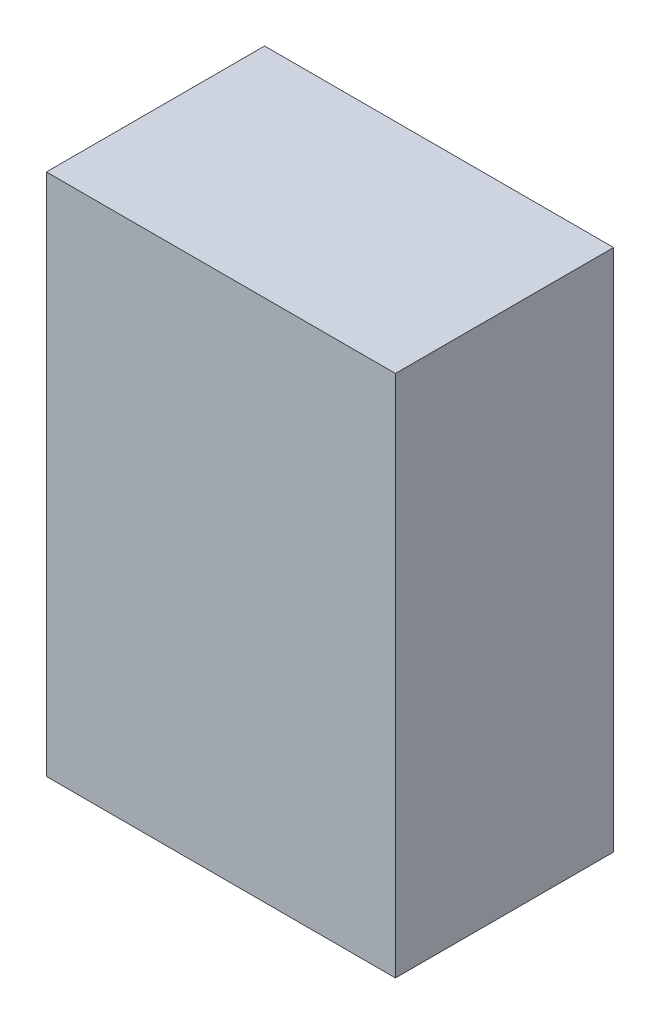
ISO-10303-21;
HEADER;
FILE_DESCRIPTION(('STEP AP214'),'2;1');
FILE_NAME('part.step','',(''),(''),'','','');
FILE_SCHEMA(('AUTOMOTIVE_DESIGN { 1 0 10303 214 1 1 1 1 }'));
ENDSEC;
DATA;
#1=APPLICATION_CONTEXT('core data for automotive mechanical design processes');
#2=APPLICATION_PROTOCOL_DEFINITION('international standard','automotive_design',2000,#1);
#3=PRODUCT_CONTEXT('',#1,'mechanical');
#4=PRODUCT('Part','Part','',(#3));
#5=PRODUCT_RELATED_PRODUCT_CATEGORY('part','',(#4));
#6=PRODUCT_DEFINITION_FORMATION('','',#4);
#7=PRODUCT_DEFINITION_CONTEXT('part definition',#1,'design');
#8=PRODUCT_DEFINITION('design','',#6,#7);
#9=PRODUCT_DEFINITION_SHAPE('','',#8);
#10=(LENGTH_UNIT() NAMED_UNIT(*) SI_UNIT(.MILLI.,.METRE.));
#11=(NAMED_UNIT(*) PLANE_ANGLE_UNIT() SI_UNIT($,.RADIAN.));
#12=(NAMED_UNIT(*) SI_UNIT($,.STERADIAN.) SOLID_ANGLE_UNIT());
#13=UNCERTAINTY_MEASURE_WITH_UNIT(LENGTH_MEASURE(1.E-05),#10,'distance_accuracy_value','');
#14=(GEOMETRIC_REPRESENTATION_CONTEXT(3) GLOBAL_UNCERTAINTY_ASSIGNED_CONTEXT((#13)) GLOBAL_UNIT_ASSIGNED_CONTEXT((#10,
#11,#12)) REPRESENTATION_CONTEXT('',''));
#15=CARTESIAN_POINT('',(0.,0.,0.));
#16=DIRECTION('',(0.,0.,1.));
#17=DIRECTION('',(1.,0.,0.));
#18=AXIS2_PLACEMENT_3D('',#15,#16,#17);
#19=CARTESIAN_POINT('',(40.,120.,25.));
#20=DIRECTION('',(-1.,0.,0.));
#21=DIRECTION('',(0.,0.,1.));
#22=AXIS2_PLACEMENT_3D('',#19,#20,#21);
#23=PLANE('',#22);
#24=DIRECTION('',(0.,0.,-1.));
#25=VECTOR('',#24,1.);
#26=CARTESIAN_POINT('',(40.,0.,25.));
#27=LINE('',#26,#25);
#28=CARTESIAN_POINT('',(40.,0.,25.));
#29=VERTEX_POINT('',#28);
#30=CARTESIAN_POINT('',(40.,0.,-25.));
#31=VERTEX_POINT('',#30);
#32=EDGE_CURVE('E102',#29,#31,#27,.T.);
#33=ORIENTED_EDGE('',*,*,#32,.T.);
#34=DIRECTION('',(0.,-1.,0.));
#35=VECTOR('',#34,1.);
#36=CARTESIAN_POINT('',(40.,120.,-25.));
#37=LINE('',#36,#35);
#38=CARTESIAN_POINT('',(40.,120.,-25.));
#39=VERTEX_POINT('',#38);
#40=EDGE_CURVE('E11',#39,#31,#37,.T.);
#41=ORIENTED_EDGE('',*,*,#40,.F.);
#42=DIRECTION('',(0.,0.,-1.));
#43=VECTOR('',#42,1.);
#44=CARTESIAN_POINT('',(40.,120.,25.));
#45=LINE('',#44,#43);
#46=CARTESIAN_POINT('',(40.,120.,25.));
#47=VERTEX_POINT('',#46);
#48=EDGE_CURVE('E90',#47,#39,#45,.T.);
#49=ORIENTED_EDGE('',*,*,#48,.F.);
#50=DIRECTION('',(0.,-1.,0.));
#51=VECTOR('',#50,1.);
#52=CARTESIAN_POINT('',(40.,120.,25.));
#53=LINE('',#52,#51);
#54=EDGE_CURVE('E98',#47,#29,#53,.T.);
#55=ORIENTED_EDGE('',*,*,#54,.T.);
#56=EDGE_LOOP('',(#33,#41,#49,#55));
#57=FACE_BOUND('',#56,.T.);
#58=ADVANCED_FACE('F39',(#57),#23,.F.);
#59=CARTESIAN_POINT('',(-40.,120.,-25.));
#60=DIRECTION('',(0.,0.,1.));
#61=DIRECTION('',(1.,0.,0.));
#62=AXIS2_PLACEMENT_3D('',#59,#60,#61);
#63=PLANE('',#62);
#64=DIRECTION('',(-1.,0.,0.));
#65=VECTOR('',#64,1.);
#66=CARTESIAN_POINT('',(-40.,0.,-25.));
#67=LINE('',#66,#65);
#68=CARTESIAN_POINT('',(-40.,0.,-25.));
#69=VERTEX_POINT('',#68);
#70=EDGE_CURVE('E94',#31,#69,#67,.T.);
#71=ORIENTED_EDGE('',*,*,#70,.T.);
#72=DIRECTION('',(0.,-1.,0.));
#73=VECTOR('',#72,1.);
#74=CARTESIAN_POINT('',(-40.,120.,-25.));
#75=LINE('',#74,#73);
#76=CARTESIAN_POINT('',(-40.,120.,-25.));
#77=VERTEX_POINT('',#76);
#78=EDGE_CURVE('E47',#77,#69,#75,.T.);
#79=ORIENTED_EDGE('',*,*,#78,.F.);
#80=DIRECTION('',(-1.,0.,0.));
#81=VECTOR('',#80,1.);
#82=CARTESIAN_POINT('',(-40.,120.,-25.));
#83=LINE('',#82,#81);
#84=EDGE_CURVE('E85',#39,#77,#83,.T.);
#85=ORIENTED_EDGE('',*,*,#84,.F.);
#86=ORIENTED_EDGE('',*,*,#40,.T.);
#87=EDGE_LOOP('',(#71,#79,#85,#86));
#88=FACE_BOUND('',#87,.T.);
#89=ADVANCED_FACE('F93',(#88),#63,.F.);
#90=CARTESIAN_POINT('',(-40.,120.,25.));
#91=DIRECTION('',(1.,0.,0.));
#92=DIRECTION('',(0.,0.,-1.));
#93=AXIS2_PLACEMENT_3D('',#90,#91,#92);
#94=PLANE('',#93);
#95=DIRECTION('',(0.,0.,1.));
#96=VECTOR('',#95,1.);
#97=CARTESIAN_POINT('',(-40.,0.,25.));
#98=LINE('',#97,#96);
#99=CARTESIAN_POINT('',(-40.,0.,25.));
#100=VERTEX_POINT('',#99);
#101=EDGE_CURVE('E72',#69,#100,#98,.T.);
#102=ORIENTED_EDGE('',*,*,#101,.T.);
#103=DIRECTION('',(0.,-1.,0.));
#104=VECTOR('',#103,1.);
#105=CARTESIAN_POINT('',(-40.,120.,25.));
#106=LINE('',#105,#104);
#107=CARTESIAN_POINT('',(-40.,120.,25.));
#108=VERTEX_POINT('',#107);
#109=EDGE_CURVE('E95',#108,#100,#106,.T.);
#110=ORIENTED_EDGE('',*,*,#109,.F.);
#111=DIRECTION('',(0.,0.,1.));
#112=VECTOR('',#111,1.);
#113=CARTESIAN_POINT('',(-40.,120.,25.));
#114=LINE('',#113,#112);
#115=EDGE_CURVE('E88',#77,#108,#114,.T.);
#116=ORIENTED_EDGE('',*,*,#115,.F.);
#117=ORIENTED_EDGE('',*,*,#78,.T.);
#118=EDGE_LOOP('',(#102,#110,#116,#117));
#119=FACE_BOUND('',#118,.T.);
#120=ADVANCED_FACE('F96',(#119),#94,.F.);
#121=CARTESIAN_POINT('',(-40.,120.,25.));
#122=DIRECTION('',(0.,0.,-1.));
#123=DIRECTION('',(-1.,0.,0.));
#124=AXIS2_PLACEMENT_3D('',#121,#122,#123);
#125=PLANE('',#124);
#126=DIRECTION('',(1.,0.,0.));
#127=VECTOR('',#126,1.);
#128=CARTESIAN_POINT('',(-40.,0.,25.));
#129=LINE('',#128,#127);
#130=EDGE_CURVE('E78',#100,#29,#129,.T.);
#131=ORIENTED_EDGE('',*,*,#130,.T.);
#132=ORIENTED_EDGE('',*,*,#54,.F.);
#133=DIRECTION('',(1.,0.,0.));
#134=VECTOR('',#133,1.);
#135=CARTESIAN_POINT('',(-40.,120.,25.));
#136=LINE('',#135,#134);
#137=EDGE_CURVE('E55',#108,#47,#136,.T.);
#138=ORIENTED_EDGE('',*,*,#137,.F.);
#139=ORIENTED_EDGE('',*,*,#109,.T.);
#140=EDGE_LOOP('',(#131,#132,#138,#139));
#141=FACE_BOUND('',#140,.T.);
#142=ADVANCED_FACE('F109',(#141),#125,.F.);
#143=CARTESIAN_POINT('',(0.,120.,0.));
#144=DIRECTION('',(0.,-1.,0.));
#145=DIRECTION('',(0.,0.,-1.));
#146=AXIS2_PLACEMENT_3D('',#143,#144,#145);
#147=PLANE('',#146);
#148=ORIENTED_EDGE('',*,*,#48,.T.);
#149=ORIENTED_EDGE('',*,*,#84,.T.);
#150=ORIENTED_EDGE('',*,*,#115,.T.);
#151=ORIENTED_EDGE('',*,*,#137,.T.);
#152=EDGE_LOOP('',(#148,#149,#150,#151));
#153=FACE_BOUND('',#152,.T.);
#154=ADVANCED_FACE('F86',(#153),#147,.F.);
#155=CARTESIAN_POINT('',(0.,0.,0.));
#156=DIRECTION('',(0.,-1.,0.));
#157=DIRECTION('',(0.,0.,-1.));
#158=AXIS2_PLACEMENT_3D('',#155,#156,#157);
#159=PLANE('',#158);
#160=ORIENTED_EDGE('',*,*,#32,.F.);
#161=ORIENTED_EDGE('',*,*,#130,.F.);
#162=ORIENTED_EDGE('',*,*,#101,.F.);
#163=ORIENTED_EDGE('',*,*,#70,.F.);
#164=EDGE_LOOP('',(#160,#161,#162,#163));
#165=FACE_BOUND('',#164,.T.);
#166=ADVANCED_FACE('F112',(#165),#159,.T.);
#167=CLOSED_SHELL('',(#58,#89,#120,#142,#154,#166));
#168=MANIFOLD_SOLID_BREP('B2',#167);
#169=ADVANCED_BREP_SHAPE_REPRESENTATION('',(#18,#168),#14);
#170=SHAPE_DEFINITION_REPRESENTATION(#9,#169);
ENDSEC;
END-ISO-10303-21;
